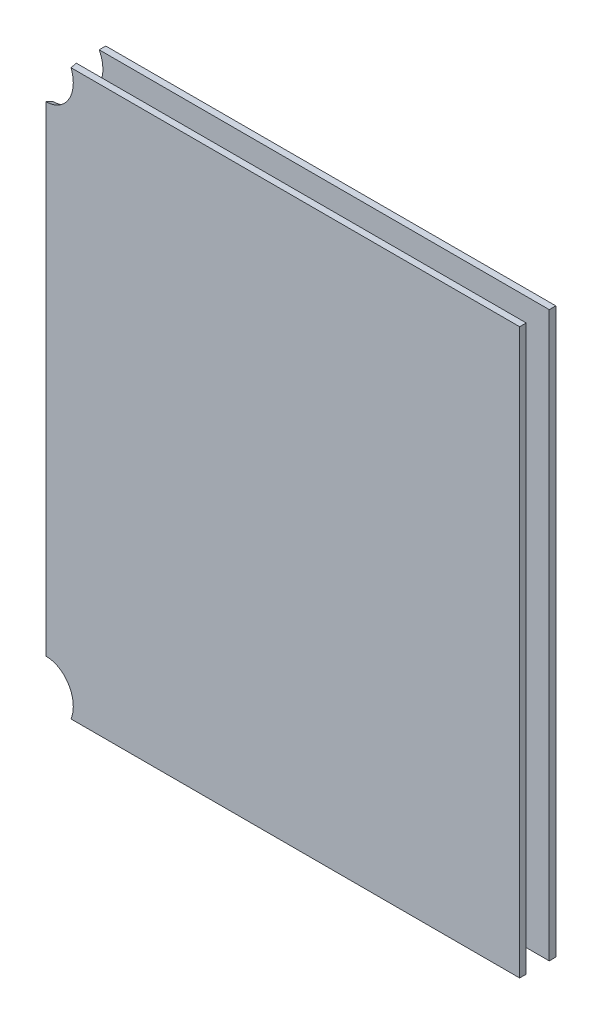
ISO-10303-21;
HEADER;
FILE_DESCRIPTION(('STEP AP214'),'2;1');
FILE_NAME('part.step','',(''),(''),'','','');
FILE_SCHEMA(('AUTOMOTIVE_DESIGN { 1 0 10303 214 1 1 1 1 }'));
ENDSEC;
DATA;
#1=APPLICATION_CONTEXT('core data for automotive mechanical design processes');
#2=APPLICATION_PROTOCOL_DEFINITION('international standard','automotive_design',2000,#1);
#3=PRODUCT_CONTEXT('',#1,'mechanical');
#4=PRODUCT('Part','Part','',(#3));
#5=PRODUCT_RELATED_PRODUCT_CATEGORY('part','',(#4));
#6=PRODUCT_DEFINITION_FORMATION('','',#4);
#7=PRODUCT_DEFINITION_CONTEXT('part definition',#1,'design');
#8=PRODUCT_DEFINITION('design','',#6,#7);
#9=PRODUCT_DEFINITION_SHAPE('','',#8);
#10=(LENGTH_UNIT() NAMED_UNIT(*) SI_UNIT(.MILLI.,.METRE.));
#11=(NAMED_UNIT(*) PLANE_ANGLE_UNIT() SI_UNIT($,.RADIAN.));
#12=(NAMED_UNIT(*) SI_UNIT($,.STERADIAN.) SOLID_ANGLE_UNIT());
#13=UNCERTAINTY_MEASURE_WITH_UNIT(LENGTH_MEASURE(1.E-05),#10,'distance_accuracy_value','');
#14=(GEOMETRIC_REPRESENTATION_CONTEXT(3) GLOBAL_UNCERTAINTY_ASSIGNED_CONTEXT((#13)) GLOBAL_UNIT_ASSIGNED_CONTEXT((#10,
#11,#12)) REPRESENTATION_CONTEXT('',''));
#15=CARTESIAN_POINT('',(0.,0.,0.));
#16=DIRECTION('',(0.,0.,1.));
#17=DIRECTION('',(1.,0.,0.));
#18=AXIS2_PLACEMENT_3D('',#15,#16,#17);
#19=CARTESIAN_POINT('',(906.3228,-128.907456059988,-15.875));
#20=DIRECTION('',(0.,0.,-1.));
#21=DIRECTION('',(0.,-1.,0.));
#22=AXIS2_PLACEMENT_3D('',#19,#20,#21);
#23=ELLIPSE('',#22,14.4349095727765,13.081);
#24=DIRECTION('',(0.,0.,1.));
#25=VECTOR('',#24,1.);
#26=SURFACE_OF_LINEAR_EXTRUSION('',#23,#25);
#27=CARTESIAN_POINT('',(906.3228,-128.907456059988,-12.7));
#28=DIRECTION('',(0.,0.,-1.));
#29=DIRECTION('',(0.,-1.,0.));
#30=AXIS2_PLACEMENT_3D('',#27,#28,#29);
#31=ELLIPSE('',#30,14.4349095727765,13.081);
#32=CARTESIAN_POINT('',(906.3228,-114.472546487211,-12.7));
#33=VERTEX_POINT('',#32);
#34=CARTESIAN_POINT('',(917.629380503944,-136.166603714,-12.7));
#35=VERTEX_POINT('',#34);
#36=EDGE_CURVE('E159',#33,#35,#31,.T.);
#37=ORIENTED_EDGE('',*,*,#36,.F.);
#38=DIRECTION('',(0.,0.,1.));
#39=VECTOR('',#38,1.);
#40=CARTESIAN_POINT('',(906.3228,-114.472546487211,-15.875));
#41=LINE('',#40,#39);
#42=CARTESIAN_POINT('',(906.3228,-114.472546487211,-15.875));
#43=VERTEX_POINT('',#42);
#44=EDGE_CURVE('E12',#43,#33,#41,.T.);
#45=ORIENTED_EDGE('',*,*,#44,.F.);
#46=CARTESIAN_POINT('',(917.629380503944,-136.166603714,-15.875));
#47=VERTEX_POINT('',#46);
#48=EDGE_CURVE('E165',#43,#47,#23,.T.);
#49=ORIENTED_EDGE('',*,*,#48,.T.);
#50=DIRECTION('',(0.,0.,1.));
#51=VECTOR('',#50,1.);
#52=CARTESIAN_POINT('',(917.629380503944,-136.166603714,-15.875));
#53=LINE('',#52,#51);
#54=EDGE_CURVE('E53',#47,#35,#53,.T.);
#55=ORIENTED_EDGE('',*,*,#54,.T.);
#56=EDGE_LOOP('',(#37,#45,#49,#55));
#57=FACE_BOUND('',#56,.T.);
#58=ADVANCED_FACE('F49',(#57),#26,.T.);
#59=CARTESIAN_POINT('',(906.3228,114.472546487211,-15.875));
#60=DIRECTION('',(-1.,0.,0.));
#61=DIRECTION('',(0.,0.,1.));
#62=AXIS2_PLACEMENT_3D('',#59,#60,#61);
#63=PLANE('',#62);
#64=DIRECTION('',(0.,-1.,0.));
#65=VECTOR('',#64,1.);
#66=CARTESIAN_POINT('',(906.3228,114.472546487211,-12.7));
#67=LINE('',#66,#65);
#68=CARTESIAN_POINT('',(906.3228,114.472546487211,-12.7));
#69=VERTEX_POINT('',#68);
#70=EDGE_CURVE('E164',#69,#33,#67,.T.);
#71=ORIENTED_EDGE('',*,*,#70,.F.);
#72=DIRECTION('',(0.,0.,1.));
#73=VECTOR('',#72,1.);
#74=CARTESIAN_POINT('',(906.3228,114.472546487211,-15.875));
#75=LINE('',#74,#73);
#76=CARTESIAN_POINT('',(906.3228,114.472546487211,-15.875));
#77=VERTEX_POINT('',#76);
#78=EDGE_CURVE('E59',#77,#69,#75,.T.);
#79=ORIENTED_EDGE('',*,*,#78,.F.);
#80=DIRECTION('',(0.,-1.,0.));
#81=VECTOR('',#80,1.);
#82=CARTESIAN_POINT('',(906.3228,114.472546487211,-15.875));
#83=LINE('',#82,#81);
#84=EDGE_CURVE('E125',#77,#43,#83,.T.);
#85=ORIENTED_EDGE('',*,*,#84,.T.);
#86=ORIENTED_EDGE('',*,*,#44,.T.);
#87=EDGE_LOOP('',(#71,#79,#85,#86));
#88=FACE_BOUND('',#87,.T.);
#89=ADVANCED_FACE('F140',(#88),#63,.T.);
#90=CARTESIAN_POINT('',(906.3228,128.907456059988,-15.875));
#91=DIRECTION('',(0.,0.,-1.));
#92=DIRECTION('',(0.,1.,0.));
#93=AXIS2_PLACEMENT_3D('',#90,#91,#92);
#94=ELLIPSE('',#93,14.4349095727765,13.081);
#95=DIRECTION('',(0.,0.,1.));
#96=VECTOR('',#95,1.);
#97=SURFACE_OF_LINEAR_EXTRUSION('',#94,#96);
#98=CARTESIAN_POINT('',(906.3228,128.907456059988,-12.7));
#99=DIRECTION('',(0.,0.,-1.));
#100=DIRECTION('',(0.,1.,0.));
#101=AXIS2_PLACEMENT_3D('',#98,#99,#100);
#102=ELLIPSE('',#101,14.4349095727765,13.081);
#103=CARTESIAN_POINT('',(917.629380503944,136.166603714,-12.7));
#104=VERTEX_POINT('',#103);
#105=EDGE_CURVE('E112',#104,#69,#102,.T.);
#106=ORIENTED_EDGE('',*,*,#105,.F.);
#107=DIRECTION('',(0.,0.,1.));
#108=VECTOR('',#107,1.);
#109=CARTESIAN_POINT('',(917.629380503944,136.166603714,-15.875));
#110=LINE('',#109,#108);
#111=CARTESIAN_POINT('',(917.629380503944,136.166603714,-15.875));
#112=VERTEX_POINT('',#111);
#113=EDGE_CURVE('E107',#112,#104,#110,.T.);
#114=ORIENTED_EDGE('',*,*,#113,.F.);
#115=EDGE_CURVE('E110',#112,#77,#94,.T.);
#116=ORIENTED_EDGE('',*,*,#115,.T.);
#117=ORIENTED_EDGE('',*,*,#78,.T.);
#118=EDGE_LOOP('',(#106,#114,#116,#117));
#119=FACE_BOUND('',#118,.T.);
#120=ADVANCED_FACE('F109',(#119),#97,.T.);
#121=CARTESIAN_POINT('',(1134.9228,136.166603714,-15.875));
#122=DIRECTION('',(0.,1.,0.));
#123=DIRECTION('',(0.,0.,1.));
#124=AXIS2_PLACEMENT_3D('',#121,#122,#123);
#125=PLANE('',#124);
#126=DIRECTION('',(-1.,0.,0.));
#127=VECTOR('',#126,1.);
#128=CARTESIAN_POINT('',(1134.9228,136.166603714,-12.7));
#129=LINE('',#128,#127);
#130=CARTESIAN_POINT('',(1134.9228,136.166603714,-12.7));
#131=VERTEX_POINT('',#130);
#132=EDGE_CURVE('E167',#131,#104,#129,.T.);
#133=ORIENTED_EDGE('',*,*,#132,.F.);
#134=DIRECTION('',(0.,0.,1.));
#135=VECTOR('',#134,1.);
#136=CARTESIAN_POINT('',(1134.9228,136.166603714,-15.875));
#137=LINE('',#136,#135);
#138=CARTESIAN_POINT('',(1134.9228,136.166603714,-15.875));
#139=VERTEX_POINT('',#138);
#140=EDGE_CURVE('E117',#139,#131,#137,.T.);
#141=ORIENTED_EDGE('',*,*,#140,.F.);
#142=DIRECTION('',(-1.,0.,0.));
#143=VECTOR('',#142,1.);
#144=CARTESIAN_POINT('',(1134.9228,136.166603714,-15.875));
#145=LINE('',#144,#143);
#146=EDGE_CURVE('E123',#139,#112,#145,.T.);
#147=ORIENTED_EDGE('',*,*,#146,.T.);
#148=ORIENTED_EDGE('',*,*,#113,.T.);
#149=EDGE_LOOP('',(#133,#141,#147,#148));
#150=FACE_BOUND('',#149,.T.);
#151=ADVANCED_FACE('F127',(#150),#125,.T.);
#152=CARTESIAN_POINT('',(1134.9228,-136.166603714,-15.875));
#153=DIRECTION('',(1.,0.,0.));
#154=DIRECTION('',(0.,0.,-1.));
#155=AXIS2_PLACEMENT_3D('',#152,#153,#154);
#156=PLANE('',#155);
#157=DIRECTION('',(0.,1.,0.));
#158=VECTOR('',#157,1.);
#159=CARTESIAN_POINT('',(1134.9228,-136.166603714,-12.7));
#160=LINE('',#159,#158);
#161=CARTESIAN_POINT('',(1134.9228,-136.166603714,-12.7));
#162=VERTEX_POINT('',#161);
#163=EDGE_CURVE('E175',#162,#131,#160,.T.);
#164=ORIENTED_EDGE('',*,*,#163,.F.);
#165=DIRECTION('',(0.,0.,1.));
#166=VECTOR('',#165,1.);
#167=CARTESIAN_POINT('',(1134.9228,-136.166603714,-15.875));
#168=LINE('',#167,#166);
#169=CARTESIAN_POINT('',(1134.9228,-136.166603714,-15.875));
#170=VERTEX_POINT('',#169);
#171=EDGE_CURVE('E172',#170,#162,#168,.T.);
#172=ORIENTED_EDGE('',*,*,#171,.F.);
#173=DIRECTION('',(0.,1.,0.));
#174=VECTOR('',#173,1.);
#175=CARTESIAN_POINT('',(1134.9228,-136.166603714,-15.875));
#176=LINE('',#175,#174);
#177=EDGE_CURVE('E128',#170,#139,#176,.T.);
#178=ORIENTED_EDGE('',*,*,#177,.T.);
#179=ORIENTED_EDGE('',*,*,#140,.T.);
#180=EDGE_LOOP('',(#164,#172,#178,#179));
#181=FACE_BOUND('',#180,.T.);
#182=ADVANCED_FACE('F144',(#181),#156,.T.);
#183=CARTESIAN_POINT('',(917.629380503944,-136.166603714,-15.875));
#184=DIRECTION('',(0.,-1.,0.));
#185=DIRECTION('',(0.,0.,-1.));
#186=AXIS2_PLACEMENT_3D('',#183,#184,#185);
#187=PLANE('',#186);
#188=DIRECTION('',(1.,0.,0.));
#189=VECTOR('',#188,1.);
#190=CARTESIAN_POINT('',(917.629380503944,-136.166603714,-12.7));
#191=LINE('',#190,#189);
#192=EDGE_CURVE('E163',#35,#162,#191,.T.);
#193=ORIENTED_EDGE('',*,*,#192,.F.);
#194=ORIENTED_EDGE('',*,*,#54,.F.);
#195=DIRECTION('',(1.,0.,0.));
#196=VECTOR('',#195,1.);
#197=CARTESIAN_POINT('',(917.629380503944,-136.166603714,-15.875));
#198=LINE('',#197,#196);
#199=EDGE_CURVE('E130',#47,#170,#198,.T.);
#200=ORIENTED_EDGE('',*,*,#199,.T.);
#201=ORIENTED_EDGE('',*,*,#171,.T.);
#202=EDGE_LOOP('',(#193,#194,#200,#201));
#203=FACE_BOUND('',#202,.T.);
#204=ADVANCED_FACE('F146',(#203),#187,.T.);
#205=CARTESIAN_POINT('',(906.3228,-128.907456059988,-15.875));
#206=DIRECTION('',(0.,0.,1.));
#207=DIRECTION('',(1.,0.,0.));
#208=AXIS2_PLACEMENT_3D('',#205,#206,#207);
#209=PLANE('',#208);
#210=ORIENTED_EDGE('',*,*,#48,.F.);
#211=ORIENTED_EDGE('',*,*,#84,.F.);
#212=ORIENTED_EDGE('',*,*,#115,.F.);
#213=ORIENTED_EDGE('',*,*,#146,.F.);
#214=ORIENTED_EDGE('',*,*,#177,.F.);
#215=ORIENTED_EDGE('',*,*,#199,.F.);
#216=EDGE_LOOP('',(#210,#211,#212,#213,#214,#215));
#217=FACE_BOUND('',#216,.T.);
#218=ADVANCED_FACE('F121',(#217),#209,.F.);
#219=CARTESIAN_POINT('',(906.3228,-128.907456059988,-12.7));
#220=DIRECTION('',(0.,0.,1.));
#221=DIRECTION('',(1.,0.,0.));
#222=AXIS2_PLACEMENT_3D('',#219,#220,#221);
#223=PLANE('',#222);
#224=ORIENTED_EDGE('',*,*,#36,.T.);
#225=ORIENTED_EDGE('',*,*,#192,.T.);
#226=ORIENTED_EDGE('',*,*,#163,.T.);
#227=ORIENTED_EDGE('',*,*,#132,.T.);
#228=ORIENTED_EDGE('',*,*,#105,.T.);
#229=ORIENTED_EDGE('',*,*,#70,.T.);
#230=EDGE_LOOP('',(#224,#225,#226,#227,#228,#229));
#231=FACE_BOUND('',#230,.T.);
#232=ADVANCED_FACE('F152',(#231),#223,.T.);
#233=CLOSED_SHELL('',(#58,#89,#120,#151,#182,#204,#218,#232));
#234=MANIFOLD_SOLID_BREP('B2',#233);
#235=CARTESIAN_POINT('',(906.3228,-136.166603714,1.5875));
#236=DIRECTION('',(1.,0.,0.));
#237=DIRECTION('',(0.,0.,-1.));
#238=AXIS2_PLACEMENT_3D('',#235,#236,#237);
#239=PLANE('',#238);
#240=DIRECTION('',(0.,-1.,0.));
#241=VECTOR('',#240,1.);
#242=CARTESIAN_POINT('',(906.3228,-136.166603714,-1.5875));
#243=LINE('',#242,#241);
#244=CARTESIAN_POINT('',(906.3228,114.472546487211,-1.5875));
#245=VERTEX_POINT('',#244);
#246=CARTESIAN_POINT('',(906.3228,-114.472546487211,-1.5875));
#247=VERTEX_POINT('',#246);
#248=EDGE_CURVE('E305',#245,#247,#243,.T.);
#249=ORIENTED_EDGE('',*,*,#248,.T.);
#250=DIRECTION('',(0.,-0.422836723251873,0.906205884702599));
#251=VECTOR('',#250,1.);
#252=CARTESIAN_POINT('',(906.3228,-69.6605486184023,-97.6266894575472));
#253=LINE('',#252,#251);
#254=CARTESIAN_POINT('',(906.322800000001,-115.954005192112,1.58750000000001));
#255=VERTEX_POINT('',#254);
#256=EDGE_CURVE('E240',#247,#255,#253,.T.);
#257=ORIENTED_EDGE('',*,*,#256,.T.);
#258=DIRECTION('',(0.,-1.,0.));
#259=VECTOR('',#258,1.);
#260=CARTESIAN_POINT('',(906.3228,-136.166603714,1.5875));
#261=LINE('',#260,#259);
#262=CARTESIAN_POINT('',(906.322800000001,115.954005192112,1.58750000000001));
#263=VERTEX_POINT('',#262);
#264=EDGE_CURVE('E300',#263,#255,#261,.T.);
#265=ORIENTED_EDGE('',*,*,#264,.F.);
#266=DIRECTION('',(0.,0.422836723251873,0.906205884702599));
#267=VECTOR('',#266,1.);
#268=CARTESIAN_POINT('',(906.3228,69.6605486184023,-97.6266894575472));
#269=LINE('',#268,#267);
#270=EDGE_CURVE('E327',#245,#263,#269,.T.);
#271=ORIENTED_EDGE('',*,*,#270,.F.);
#272=EDGE_LOOP('',(#249,#257,#265,#271));
#273=FACE_BOUND('',#272,.T.);
#274=ADVANCED_FACE('F226',(#273),#239,.F.);
#275=CARTESIAN_POINT('',(1134.9228,-136.166603714,1.5875));
#276=DIRECTION('',(0.,1.,0.));
#277=DIRECTION('',(0.,0.,1.));
#278=AXIS2_PLACEMENT_3D('',#275,#276,#277);
#279=PLANE('',#278);
#280=DIRECTION('',(1.,0.,0.));
#281=VECTOR('',#280,1.);
#282=CARTESIAN_POINT('',(1134.9228,-136.166603714,1.5875));
#283=LINE('',#282,#281);
#284=CARTESIAN_POINT('',(918.310260679832,-136.166603714,1.5875));
#285=VERTEX_POINT('',#284);
#286=CARTESIAN_POINT('',(1134.9228,-136.166603714,1.5875));
#287=VERTEX_POINT('',#286);
#288=EDGE_CURVE('E288',#285,#287,#283,.T.);
#289=ORIENTED_EDGE('',*,*,#288,.F.);
#290=CARTESIAN_POINT('',(906.3228,-136.166603714,13.9699999999996));
#291=DIRECTION('',(0.,1.,0.));
#292=DIRECTION('',(0.,0.,1.));
#293=AXIS2_PLACEMENT_3D('',#290,#291,#292);
#294=ELLIPSE('',#293,30.9362911986431,13.081);
#295=CARTESIAN_POINT('',(917.629380503944,-136.166603714,-1.5875));
#296=VERTEX_POINT('',#295);
#297=EDGE_CURVE('E277',#285,#296,#294,.T.);
#298=ORIENTED_EDGE('',*,*,#297,.T.);
#299=DIRECTION('',(1.,0.,0.));
#300=VECTOR('',#299,1.);
#301=CARTESIAN_POINT('',(1134.9228,-136.166603714,-1.5875));
#302=LINE('',#301,#300);
#303=CARTESIAN_POINT('',(1134.9228,-136.166603714,-1.5875));
#304=VERTEX_POINT('',#303);
#305=EDGE_CURVE('E286',#296,#304,#302,.T.);
#306=ORIENTED_EDGE('',*,*,#305,.T.);
#307=DIRECTION('',(0.,0.,-1.));
#308=VECTOR('',#307,1.);
#309=CARTESIAN_POINT('',(1134.9228,-136.166603714,1.5875));
#310=LINE('',#309,#308);
#311=EDGE_CURVE('E310',#287,#304,#310,.T.);
#312=ORIENTED_EDGE('',*,*,#311,.F.);
#313=EDGE_LOOP('',(#289,#298,#306,#312));
#314=FACE_BOUND('',#313,.T.);
#315=ADVANCED_FACE('F228',(#314),#279,.F.);
#316=CARTESIAN_POINT('',(1134.9228,-136.166603714,1.5875));
#317=DIRECTION('',(-1.,0.,0.));
#318=DIRECTION('',(0.,0.,1.));
#319=AXIS2_PLACEMENT_3D('',#316,#317,#318);
#320=PLANE('',#319);
#321=DIRECTION('',(0.,1.,0.));
#322=VECTOR('',#321,1.);
#323=CARTESIAN_POINT('',(1134.9228,-136.166603714,-1.5875));
#324=LINE('',#323,#322);
#325=CARTESIAN_POINT('',(1134.9228,136.166603714,-1.5875));
#326=VERTEX_POINT('',#325);
#327=EDGE_CURVE('E292',#304,#326,#324,.T.);
#328=ORIENTED_EDGE('',*,*,#327,.T.);
#329=DIRECTION('',(0.,0.,-1.));
#330=VECTOR('',#329,1.);
#331=CARTESIAN_POINT('',(1134.9228,136.166603714,1.5875));
#332=LINE('',#331,#330);
#333=CARTESIAN_POINT('',(1134.9228,136.166603714,1.5875));
#334=VERTEX_POINT('',#333);
#335=EDGE_CURVE('E307',#334,#326,#332,.T.);
#336=ORIENTED_EDGE('',*,*,#335,.F.);
#337=DIRECTION('',(0.,1.,0.));
#338=VECTOR('',#337,1.);
#339=CARTESIAN_POINT('',(1134.9228,-136.166603714,1.5875));
#340=LINE('',#339,#338);
#341=EDGE_CURVE('E321',#287,#334,#340,.T.);
#342=ORIENTED_EDGE('',*,*,#341,.F.);
#343=ORIENTED_EDGE('',*,*,#311,.T.);
#344=EDGE_LOOP('',(#328,#336,#342,#343));
#345=FACE_BOUND('',#344,.T.);
#346=ADVANCED_FACE('F320',(#345),#320,.F.);
#347=CARTESIAN_POINT('',(1134.9228,136.166603714,1.5875));
#348=DIRECTION('',(0.,-1.,0.));
#349=DIRECTION('',(0.,0.,-1.));
#350=AXIS2_PLACEMENT_3D('',#347,#348,#349);
#351=PLANE('',#350);
#352=CARTESIAN_POINT('',(906.3228,136.166603714,13.9699999999996));
#353=DIRECTION('',(0.,-1.,0.));
#354=DIRECTION('',(0.,0.,1.));
#355=AXIS2_PLACEMENT_3D('',#352,#353,#354);
#356=ELLIPSE('',#355,30.9362911986431,13.081);
#357=CARTESIAN_POINT('',(918.310260679832,136.166603714,1.5875));
#358=VERTEX_POINT('',#357);
#359=CARTESIAN_POINT('',(917.629380503944,136.166603714,-1.5875));
#360=VERTEX_POINT('',#359);
#361=EDGE_CURVE('E248',#358,#360,#356,.F.);
#362=ORIENTED_EDGE('',*,*,#361,.F.);
#363=DIRECTION('',(-1.,0.,0.));
#364=VECTOR('',#363,1.);
#365=CARTESIAN_POINT('',(1134.9228,136.166603714,1.5875));
#366=LINE('',#365,#364);
#367=EDGE_CURVE('E317',#334,#358,#366,.T.);
#368=ORIENTED_EDGE('',*,*,#367,.F.);
#369=ORIENTED_EDGE('',*,*,#335,.T.);
#370=DIRECTION('',(-1.,0.,0.));
#371=VECTOR('',#370,1.);
#372=CARTESIAN_POINT('',(1134.9228,136.166603714,-1.5875));
#373=LINE('',#372,#371);
#374=EDGE_CURVE('E296',#326,#360,#373,.T.);
#375=ORIENTED_EDGE('',*,*,#374,.T.);
#376=EDGE_LOOP('',(#362,#368,#369,#375));
#377=FACE_BOUND('',#376,.T.);
#378=ADVANCED_FACE('F313',(#377),#351,.F.);
#379=CARTESIAN_POINT('',(0.,0.,1.5875));
#380=DIRECTION('',(0.,0.,-1.));
#381=DIRECTION('',(-1.,0.,0.));
#382=AXIS2_PLACEMENT_3D('',#379,#380,#381);
#383=PLANE('',#382);
#384=ORIENTED_EDGE('',*,*,#264,.T.);
#385=CARTESIAN_POINT('',(906.3228,-130.388914764888,1.58750000000001));
#386=DIRECTION('',(0.,0.,-1.));
#387=DIRECTION('',(0.,-1.,0.));
#388=AXIS2_PLACEMENT_3D('',#385,#386,#387);
#389=ELLIPSE('',#388,14.4349095727766,13.081);
#390=EDGE_CURVE('E329',#255,#285,#389,.T.);
#391=ORIENTED_EDGE('',*,*,#390,.T.);
#392=ORIENTED_EDGE('',*,*,#288,.T.);
#393=ORIENTED_EDGE('',*,*,#341,.T.);
#394=ORIENTED_EDGE('',*,*,#367,.T.);
#395=CARTESIAN_POINT('',(906.3228,130.388914764888,1.58750000000001));
#396=DIRECTION('',(0.,0.,-1.));
#397=DIRECTION('',(0.,1.,0.));
#398=AXIS2_PLACEMENT_3D('',#395,#396,#397);
#399=ELLIPSE('',#398,14.4349095727766,13.081);
#400=EDGE_CURVE('E294',#263,#358,#399,.F.);
#401=ORIENTED_EDGE('',*,*,#400,.F.);
#402=EDGE_LOOP('',(#384,#391,#392,#393,#394,#401));
#403=FACE_BOUND('',#402,.T.);
#404=ADVANCED_FACE('F335',(#403),#383,.F.);
#405=CARTESIAN_POINT('',(0.,0.,-1.5875));
#406=DIRECTION('',(0.,0.,-1.));
#407=DIRECTION('',(-1.,0.,0.));
#408=AXIS2_PLACEMENT_3D('',#405,#406,#407);
#409=PLANE('',#408);
#410=CARTESIAN_POINT('',(906.3228,-128.907456059988,-1.58750000000001));
#411=DIRECTION('',(0.,0.,-1.));
#412=DIRECTION('',(0.,-1.,0.));
#413=AXIS2_PLACEMENT_3D('',#410,#411,#412);
#414=ELLIPSE('',#413,14.4349095727766,13.081);
#415=EDGE_CURVE('E47',#247,#296,#414,.T.);
#416=ORIENTED_EDGE('',*,*,#415,.F.);
#417=ORIENTED_EDGE('',*,*,#248,.F.);
#418=CARTESIAN_POINT('',(906.3228,128.907456059988,-1.58750000000001));
#419=DIRECTION('',(0.,0.,-1.));
#420=DIRECTION('',(0.,1.,0.));
#421=AXIS2_PLACEMENT_3D('',#418,#419,#420);
#422=ELLIPSE('',#421,14.4349095727766,13.081);
#423=EDGE_CURVE('E234',#245,#360,#422,.F.);
#424=ORIENTED_EDGE('',*,*,#423,.T.);
#425=ORIENTED_EDGE('',*,*,#374,.F.);
#426=ORIENTED_EDGE('',*,*,#327,.F.);
#427=ORIENTED_EDGE('',*,*,#305,.F.);
#428=EDGE_LOOP('',(#416,#417,#424,#425,#426,#427));
#429=FACE_BOUND('',#428,.T.);
#430=ADVANCED_FACE('F290',(#429),#409,.T.);
#431=CARTESIAN_POINT('',(906.322799999999,81.514627796197,-103.157816634405));
#432=DIRECTION('',(0.,0.422836723251873,0.906205884702599));
#433=DIRECTION('',(0.,-0.906205884702599,0.422836723251873));
#434=AXIS2_PLACEMENT_3D('',#431,#432,#433);
#435=CYLINDRICAL_SURFACE('',#434,13.081);
#436=ORIENTED_EDGE('',*,*,#400,.T.);
#437=ORIENTED_EDGE('',*,*,#361,.T.);
#438=ORIENTED_EDGE('',*,*,#423,.F.);
#439=ORIENTED_EDGE('',*,*,#270,.T.);
#440=EDGE_LOOP('',(#436,#437,#438,#439));
#441=FACE_BOUND('',#440,.T.);
#442=ADVANCED_FACE('F336',(#441),#435,.F.);
#443=CARTESIAN_POINT('',(906.322799999999,-81.514627796197,-103.157816634405));
#444=DIRECTION('',(0.,-0.422836723251873,0.906205884702599));
#445=DIRECTION('',(0.,-0.906205884702599,-0.422836723251873));
#446=AXIS2_PLACEMENT_3D('',#443,#444,#445);
#447=CYLINDRICAL_SURFACE('',#446,13.081);
#448=ORIENTED_EDGE('',*,*,#256,.F.);
#449=ORIENTED_EDGE('',*,*,#415,.T.);
#450=ORIENTED_EDGE('',*,*,#297,.F.);
#451=ORIENTED_EDGE('',*,*,#390,.F.);
#452=EDGE_LOOP('',(#448,#449,#450,#451));
#453=FACE_BOUND('',#452,.T.);
#454=ADVANCED_FACE('F276',(#453),#447,.F.);
#455=CLOSED_SHELL('',(#274,#315,#346,#378,#404,#430,#442,#454));
#456=MANIFOLD_SOLID_BREP('B6_NOT_SHOWN',#455);
#457=ADVANCED_BREP_SHAPE_REPRESENTATION('',(#18,#234,#456),#14);
#458=SHAPE_DEFINITION_REPRESENTATION(#9,#457);
ENDSEC;
END-ISO-10303-21;
